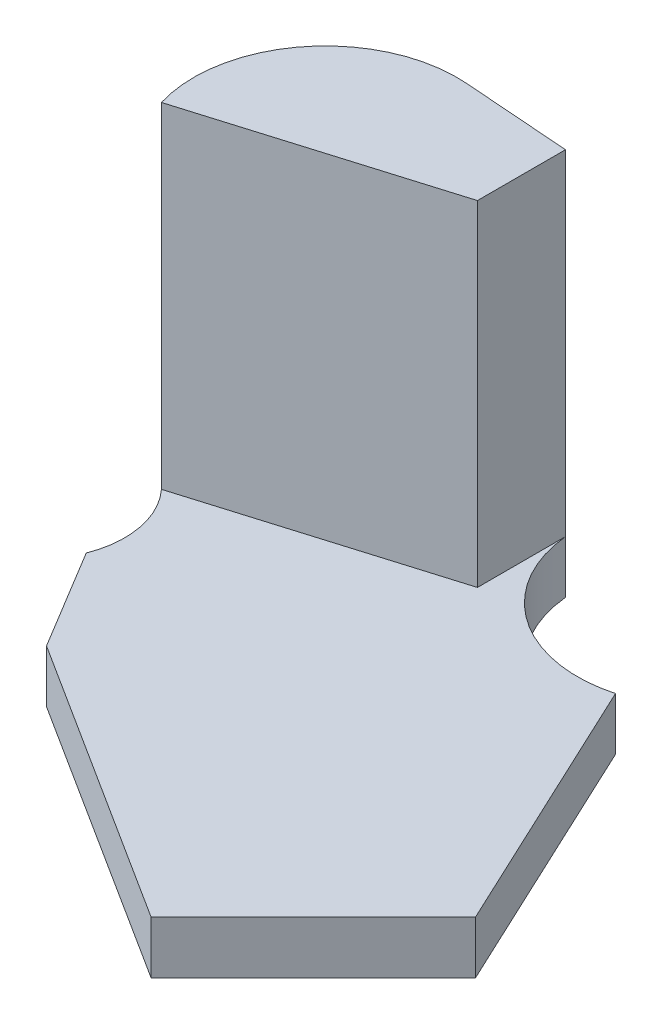
ISO-10303-21;
HEADER;
FILE_DESCRIPTION(('STEP AP214'),'2;1');
FILE_NAME('part.step','',(''),(''),'','','');
FILE_SCHEMA(('AUTOMOTIVE_DESIGN { 1 0 10303 214 1 1 1 1 }'));
ENDSEC;
DATA;
#1=APPLICATION_CONTEXT('core data for automotive mechanical design processes');
#2=APPLICATION_PROTOCOL_DEFINITION('international standard','automotive_design',2000,#1);
#3=PRODUCT_CONTEXT('',#1,'mechanical');
#4=PRODUCT('Part','Part','',(#3));
#5=PRODUCT_RELATED_PRODUCT_CATEGORY('part','',(#4));
#6=PRODUCT_DEFINITION_FORMATION('','',#4);
#7=PRODUCT_DEFINITION_CONTEXT('part definition',#1,'design');
#8=PRODUCT_DEFINITION('design','',#6,#7);
#9=PRODUCT_DEFINITION_SHAPE('','',#8);
#10=(LENGTH_UNIT() NAMED_UNIT(*) SI_UNIT(.MILLI.,.METRE.));
#11=(NAMED_UNIT(*) PLANE_ANGLE_UNIT() SI_UNIT($,.RADIAN.));
#12=(NAMED_UNIT(*) SI_UNIT($,.STERADIAN.) SOLID_ANGLE_UNIT());
#13=UNCERTAINTY_MEASURE_WITH_UNIT(LENGTH_MEASURE(1.E-05),#10,'distance_accuracy_value','');
#14=(GEOMETRIC_REPRESENTATION_CONTEXT(3) GLOBAL_UNCERTAINTY_ASSIGNED_CONTEXT((#13)) GLOBAL_UNIT_ASSIGNED_CONTEXT((#10,
#11,#12)) REPRESENTATION_CONTEXT('',''));
#15=CARTESIAN_POINT('',(0.,0.,0.));
#16=DIRECTION('',(0.,0.,1.));
#17=DIRECTION('',(1.,0.,0.));
#18=AXIS2_PLACEMENT_3D('',#15,#16,#17);
#19=CARTESIAN_POINT('',(-494.715705206403,-35.9967992820007,48.5897073050743));
#20=DIRECTION('',(0.,-1.,0.));
#21=DIRECTION('',(0.,0.,-1.));
#22=AXIS2_PLACEMENT_3D('',#19,#20,#21);
#23=PLANE('',#22);
#24=CARTESIAN_POINT('',(-494.715705206403,-35.9967992820007,48.5897073050743));
#25=DIRECTION('',(0.,-1.,0.));
#26=DIRECTION('',(0.,0.,-1.));
#27=AXIS2_PLACEMENT_3D('',#24,#25,#26);
#28=CIRCLE('',#27,19.05);
#29=CARTESIAN_POINT('',(-512.958981794907,-35.9967992820007,54.0747195489409));
#30=VERTEX_POINT('',#29);
#31=CARTESIAN_POINT('',(-493.297876549059,-35.9967992820007,29.5925427298433));
#32=VERTEX_POINT('',#31);
#33=EDGE_CURVE('E164',#30,#32,#28,.T.);
#34=ORIENTED_EDGE('',*,*,#33,.F.);
#35=DIRECTION('',(-0.957652314357131,0.,0.287927151909005));
#36=VECTOR('',#35,1.);
#37=CARTESIAN_POINT('',(-512.958981794907,-35.9967992820007,54.0747195489409));
#38=LINE('',#37,#36);
#39=CARTESIAN_POINT('',(-477.784341144421,-35.9967992820007,43.4991338691676));
#40=VERTEX_POINT('',#39);
#41=EDGE_CURVE('E172',#40,#30,#38,.T.);
#42=ORIENTED_EDGE('',*,*,#41,.F.);
#43=DIRECTION('',(0.,0.,1.));
#44=VECTOR('',#43,1.);
#45=CARTESIAN_POINT('',(-477.784341144421,-35.9967992820007,43.4991338691676));
#46=LINE('',#45,#44);
#47=CARTESIAN_POINT('',(-477.784341144421,-35.9967992820007,30.7503752572352));
#48=VERTEX_POINT('',#47);
#49=EDGE_CURVE('E169',#48,#40,#46,.T.);
#50=ORIENTED_EDGE('',*,*,#49,.F.);
#51=DIRECTION('',(0.997226486888769,0.,0.0744267011729258));
#52=VECTOR('',#51,1.);
#53=CARTESIAN_POINT('',(-477.784341144421,-35.9967992820007,30.7503752572352));
#54=LINE('',#53,#52);
#55=EDGE_CURVE('E166',#32,#48,#54,.T.);
#56=ORIENTED_EDGE('',*,*,#55,.F.);
#57=EDGE_LOOP('',(#34,#42,#50,#56));
#58=FACE_BOUND('',#57,.T.);
#59=ADVANCED_FACE('F33',(#58),#23,.F.);
#60=CARTESIAN_POINT('',(-512.958981794907,-128.061062811696,54.0747195489409));
#61=DIRECTION('',(-0.287927151909005,0.,-0.95765231435713));
#62=DIRECTION('',(-0.957652314357131,0.,0.287927151909005));
#63=AXIS2_PLACEMENT_3D('',#60,#61,#62);
#64=PLANE('',#63);
#65=DIRECTION('',(0.,1.,0.));
#66=VECTOR('',#65,1.);
#67=CARTESIAN_POINT('',(-512.958981794907,-128.061062811696,54.0747195489409));
#68=LINE('',#67,#66);
#69=CARTESIAN_POINT('',(-512.958981794907,-84.510800062,54.0747195489409));
#70=VERTEX_POINT('',#69);
#71=EDGE_CURVE('E55',#70,#30,#68,.T.);
#72=ORIENTED_EDGE('',*,*,#71,.F.);
#73=DIRECTION('',(0.957652314357131,0.,-0.287927151909005));
#74=VECTOR('',#73,1.);
#75=CARTESIAN_POINT('',(-512.958981794907,-84.510800062,54.0747195489409));
#76=LINE('',#75,#74);
#77=CARTESIAN_POINT('',(-477.784341144421,-84.510800062,43.4991338691676));
#78=VERTEX_POINT('',#77);
#79=EDGE_CURVE('E37',#70,#78,#76,.T.);
#80=ORIENTED_EDGE('',*,*,#79,.T.);
#81=DIRECTION('',(0.,1.,0.));
#82=VECTOR('',#81,1.);
#83=CARTESIAN_POINT('',(-477.784341144421,-128.061062811696,43.4991338691676));
#84=LINE('',#83,#82);
#85=EDGE_CURVE('E175',#78,#40,#84,.T.);
#86=ORIENTED_EDGE('',*,*,#85,.T.);
#87=ORIENTED_EDGE('',*,*,#41,.T.);
#88=EDGE_LOOP('',(#72,#80,#86,#87));
#89=FACE_BOUND('',#88,.T.);
#90=ADVANCED_FACE('F184',(#89),#64,.F.);
#91=CARTESIAN_POINT('',(-477.784341144421,-128.061062811696,43.4991338691676));
#92=DIRECTION('',(-1.,0.,0.));
#93=DIRECTION('',(0.,0.,1.));
#94=AXIS2_PLACEMENT_3D('',#91,#92,#93);
#95=PLANE('',#94);
#96=ORIENTED_EDGE('',*,*,#85,.F.);
#97=DIRECTION('',(0.,0.,-1.));
#98=VECTOR('',#97,1.);
#99=CARTESIAN_POINT('',(-477.784341144421,-84.510800062,43.4991338691676));
#100=LINE('',#99,#98);
#101=CARTESIAN_POINT('',(-477.784341144421,-84.510800062,30.7503752572352));
#102=VERTEX_POINT('',#101);
#103=EDGE_CURVE('E11',#78,#102,#100,.T.);
#104=ORIENTED_EDGE('',*,*,#103,.T.);
#105=DIRECTION('',(0.,1.,0.));
#106=VECTOR('',#105,1.);
#107=CARTESIAN_POINT('',(-477.784341144421,-128.061062811696,30.7503752572352));
#108=LINE('',#107,#106);
#109=EDGE_CURVE('E177',#102,#48,#108,.T.);
#110=ORIENTED_EDGE('',*,*,#109,.T.);
#111=ORIENTED_EDGE('',*,*,#49,.T.);
#112=EDGE_LOOP('',(#96,#104,#110,#111));
#113=FACE_BOUND('',#112,.T.);
#114=ADVANCED_FACE('F229',(#113),#95,.F.);
#115=CARTESIAN_POINT('',(-477.784341144421,-128.061062811696,30.7503752572352));
#116=DIRECTION('',(-0.0744267011729258,0.,0.997226486888769));
#117=DIRECTION('',(0.997226486888769,0.,0.0744267011729258));
#118=AXIS2_PLACEMENT_3D('',#115,#116,#117);
#119=PLANE('',#118);
#120=ORIENTED_EDGE('',*,*,#109,.F.);
#121=DIRECTION('',(0.,1.,0.));
#122=VECTOR('',#121,1.);
#123=CARTESIAN_POINT('',(-477.784341144421,-202.521541733011,30.7503752572352));
#124=LINE('',#123,#122);
#125=CARTESIAN_POINT('',(-477.784341144421,-92.130800062,30.7503752572352));
#126=VERTEX_POINT('',#125);
#127=EDGE_CURVE('E156',#126,#102,#124,.T.);
#128=ORIENTED_EDGE('',*,*,#127,.F.);
#129=DIRECTION('',(-0.997226486888769,0.,-0.074426701172926));
#130=VECTOR('',#129,1.);
#131=CARTESIAN_POINT('',(-493.297876549059,-92.130800062,29.5925427298433));
#132=LINE('',#131,#130);
#133=CARTESIAN_POINT('',(-493.297876549059,-92.130800062,29.5925427298433));
#134=VERTEX_POINT('',#133);
#135=EDGE_CURVE('E195',#126,#134,#132,.T.);
#136=ORIENTED_EDGE('',*,*,#135,.T.);
#137=DIRECTION('',(0.,1.,0.));
#138=VECTOR('',#137,1.);
#139=CARTESIAN_POINT('',(-493.297876549059,-128.061062811696,29.5925427298433));
#140=LINE('',#139,#138);
#141=EDGE_CURVE('E178',#134,#32,#140,.T.);
#142=ORIENTED_EDGE('',*,*,#141,.T.);
#143=ORIENTED_EDGE('',*,*,#55,.T.);
#144=EDGE_LOOP('',(#120,#128,#136,#142,#143));
#145=FACE_BOUND('',#144,.T.);
#146=ADVANCED_FACE('F236',(#145),#119,.F.);
#147=CARTESIAN_POINT('',(-494.715705206403,-128.061062811696,48.5897073050743));
#148=DIRECTION('',(0.,1.,0.));
#149=DIRECTION('',(0.,0.,1.));
#150=AXIS2_PLACEMENT_3D('',#147,#148,#149);
#151=CYLINDRICAL_SURFACE('',#150,19.05);
#152=ORIENTED_EDGE('',*,*,#141,.F.);
#153=CARTESIAN_POINT('',(-494.715705206403,-92.130800062,48.5897073050743));
#154=DIRECTION('',(0.,1.,0.));
#155=DIRECTION('',(-1.,0.,0.));
#156=AXIS2_PLACEMENT_3D('',#153,#154,#155);
#157=CIRCLE('',#156,19.05);
#158=CARTESIAN_POINT('',(-512.958981794907,-92.130800062,54.0747195489409));
#159=VERTEX_POINT('',#158);
#160=EDGE_CURVE('E188',#134,#159,#157,.T.);
#161=ORIENTED_EDGE('',*,*,#160,.T.);
#162=DIRECTION('',(0.,1.,0.));
#163=VECTOR('',#162,1.);
#164=CARTESIAN_POINT('',(-512.958981794907,-202.521541733011,54.0747195489409));
#165=LINE('',#164,#163);
#166=EDGE_CURVE('E158',#159,#70,#165,.T.);
#167=ORIENTED_EDGE('',*,*,#166,.T.);
#168=ORIENTED_EDGE('',*,*,#71,.T.);
#169=ORIENTED_EDGE('',*,*,#33,.T.);
#170=EDGE_LOOP('',(#152,#161,#167,#168,#169));
#171=FACE_BOUND('',#170,.T.);
#172=ADVANCED_FACE('F35',(#171),#151,.T.);
#173=CARTESIAN_POINT('',(-522.452719054345,-84.510800062,62.8250492098397));
#174=DIRECTION('',(0.,1.,0.));
#175=DIRECTION('',(-1.,0.,0.));
#176=AXIS2_PLACEMENT_3D('',#173,#174,#175);
#177=PLANE('',#176);
#178=ORIENTED_EDGE('',*,*,#103,.F.);
#179=ORIENTED_EDGE('',*,*,#79,.F.);
#180=CARTESIAN_POINT('',(-522.452719054345,-84.510800062,62.8250492098397));
#181=DIRECTION('',(0.,1.,0.));
#182=DIRECTION('',(-1.,0.,0.));
#183=AXIS2_PLACEMENT_3D('',#180,#181,#182);
#184=CIRCLE('',#183,12.91120894129);
#185=CARTESIAN_POINT('',(-510.419261272625,-84.510800062,67.5042809994834));
#186=VERTEX_POINT('',#185);
#187=EDGE_CURVE('E131',#186,#70,#184,.T.);
#188=ORIENTED_EDGE('',*,*,#187,.F.);
#189=DIRECTION('',(-0.516817235128694,0.,-0.856095757187204));
#190=VECTOR('',#189,1.);
#191=CARTESIAN_POINT('',(-501.653310228558,-84.510800062,82.0248754890756));
#192=LINE('',#191,#190);
#193=CARTESIAN_POINT('',(-501.653310228558,-84.510800062,82.0248754890756));
#194=VERTEX_POINT('',#193);
#195=EDGE_CURVE('E117',#194,#186,#192,.T.);
#196=ORIENTED_EDGE('',*,*,#195,.F.);
#197=DIRECTION('',(-0.843896983197998,0.,-0.536505248575741));
#198=VECTOR('',#197,1.);
#199=CARTESIAN_POINT('',(-460.055260418092,-84.510800062,108.470724328654));
#200=LINE('',#199,#198);
#201=CARTESIAN_POINT('',(-460.055260418092,-84.510800062,108.470724328654));
#202=VERTEX_POINT('',#201);
#203=EDGE_CURVE('E129',#202,#194,#200,.T.);
#204=ORIENTED_EDGE('',*,*,#203,.F.);
#205=DIRECTION('',(-0.706636743080918,0.,0.707576507049232));
#206=VECTOR('',#205,1.);
#207=CARTESIAN_POINT('',(-460.055260418092,-84.510800062,108.470724328654));
#208=LINE('',#207,#206);
#209=CARTESIAN_POINT('',(-436.59051231193,-84.510800062,84.9747701961823));
#210=VERTEX_POINT('',#209);
#211=EDGE_CURVE('E149',#210,#202,#208,.T.);
#212=ORIENTED_EDGE('',*,*,#211,.F.);
#213=DIRECTION('',(0.424571064740077,0.,0.905394616167711));
#214=VECTOR('',#213,1.);
#215=CARTESIAN_POINT('',(-436.59051231193,-84.510800062,84.9747701961823));
#216=LINE('',#215,#214);
#217=CARTESIAN_POINT('',(-454.490518062896,-84.510800062,46.8031419760217));
#218=VERTEX_POINT('',#217);
#219=EDGE_CURVE('E146',#218,#210,#216,.T.);
#220=ORIENTED_EDGE('',*,*,#219,.F.);
#221=CARTESIAN_POINT('',(-459.359636033362,-84.510800062,28.9416487520585));
#222=DIRECTION('',(0.,1.,0.));
#223=DIRECTION('',(-1.,0.,0.));
#224=AXIS2_PLACEMENT_3D('',#221,#222,#223);
#225=CIRCLE('',#224,18.5132722661339);
#226=EDGE_CURVE('E143',#102,#218,#225,.T.);
#227=ORIENTED_EDGE('',*,*,#226,.F.);
#228=EDGE_LOOP('',(#178,#179,#188,#196,#204,#212,#220,#227));
#229=FACE_BOUND('',#228,.T.);
#230=ADVANCED_FACE('F127',(#229),#177,.T.);
#231=CARTESIAN_POINT('',(-460.055260418092,-202.521541733011,108.470724328654));
#232=DIRECTION('',(-0.707576507049232,0.,-0.706636743080918));
#233=DIRECTION('',(-0.706636743080918,0.,0.707576507049232));
#234=AXIS2_PLACEMENT_3D('',#231,#232,#233);
#235=PLANE('',#234);
#236=DIRECTION('',(0.,1.,0.));
#237=VECTOR('',#236,1.);
#238=CARTESIAN_POINT('',(-460.055260418092,-202.521541733011,108.470724328654));
#239=LINE('',#238,#237);
#240=CARTESIAN_POINT('',(-460.055260418092,-92.130800062,108.470724328654));
#241=VERTEX_POINT('',#240);
#242=EDGE_CURVE('E135',#241,#202,#239,.T.);
#243=ORIENTED_EDGE('',*,*,#242,.F.);
#244=DIRECTION('',(0.706636743080918,0.,-0.707576507049232));
#245=VECTOR('',#244,1.);
#246=CARTESIAN_POINT('',(-460.055260418092,-92.130800062,108.470724328654));
#247=LINE('',#246,#245);
#248=CARTESIAN_POINT('',(-436.59051231193,-92.130800062,84.9747701961823));
#249=VERTEX_POINT('',#248);
#250=EDGE_CURVE('E123',#241,#249,#247,.T.);
#251=ORIENTED_EDGE('',*,*,#250,.T.);
#252=DIRECTION('',(0.,1.,0.));
#253=VECTOR('',#252,1.);
#254=CARTESIAN_POINT('',(-436.59051231193,-202.521541733011,84.9747701961824));
#255=LINE('',#254,#253);
#256=EDGE_CURVE('E152',#249,#210,#255,.T.);
#257=ORIENTED_EDGE('',*,*,#256,.T.);
#258=ORIENTED_EDGE('',*,*,#211,.T.);
#259=EDGE_LOOP('',(#243,#251,#257,#258));
#260=FACE_BOUND('',#259,.T.);
#261=ADVANCED_FACE('F214',(#260),#235,.F.);
#262=CARTESIAN_POINT('',(-436.59051231193,-202.521541733011,84.9747701961824));
#263=DIRECTION('',(-0.905394616167711,0.,0.424571064740077));
#264=DIRECTION('',(0.424571064740077,0.,0.905394616167711));
#265=AXIS2_PLACEMENT_3D('',#262,#263,#264);
#266=PLANE('',#265);
#267=ORIENTED_EDGE('',*,*,#256,.F.);
#268=DIRECTION('',(-0.424571064740077,0.,-0.905394616167711));
#269=VECTOR('',#268,1.);
#270=CARTESIAN_POINT('',(-436.59051231193,-92.130800062,84.9747701961823));
#271=LINE('',#270,#269);
#272=CARTESIAN_POINT('',(-454.490518062896,-92.130800062,46.8031419760217));
#273=VERTEX_POINT('',#272);
#274=EDGE_CURVE('E162',#249,#273,#271,.T.);
#275=ORIENTED_EDGE('',*,*,#274,.T.);
#276=DIRECTION('',(0.,1.,0.));
#277=VECTOR('',#276,1.);
#278=CARTESIAN_POINT('',(-454.490518062896,-202.521541733011,46.8031419760217));
#279=LINE('',#278,#277);
#280=EDGE_CURVE('E154',#273,#218,#279,.T.);
#281=ORIENTED_EDGE('',*,*,#280,.T.);
#282=ORIENTED_EDGE('',*,*,#219,.T.);
#283=EDGE_LOOP('',(#267,#275,#281,#282));
#284=FACE_BOUND('',#283,.T.);
#285=ADVANCED_FACE('F205',(#284),#266,.F.);
#286=CARTESIAN_POINT('',(-459.359636033363,-202.521541733011,28.9416487520585));
#287=DIRECTION('',(0.,1.,0.));
#288=DIRECTION('',(-1.,0.,0.));
#289=AXIS2_PLACEMENT_3D('',#286,#287,#288);
#290=CYLINDRICAL_SURFACE('',#289,18.5132722661339);
#291=ORIENTED_EDGE('',*,*,#280,.F.);
#292=CARTESIAN_POINT('',(-459.359636033362,-92.130800062,28.9416487520585));
#293=DIRECTION('',(0.,1.,0.));
#294=DIRECTION('',(-1.,0.,0.));
#295=AXIS2_PLACEMENT_3D('',#292,#293,#294);
#296=CIRCLE('',#295,18.5132722661339);
#297=EDGE_CURVE('E199',#273,#126,#296,.F.);
#298=ORIENTED_EDGE('',*,*,#297,.T.);
#299=ORIENTED_EDGE('',*,*,#127,.T.);
#300=ORIENTED_EDGE('',*,*,#226,.T.);
#301=EDGE_LOOP('',(#291,#298,#299,#300));
#302=FACE_BOUND('',#301,.T.);
#303=ADVANCED_FACE('F210',(#302),#290,.F.);
#304=CARTESIAN_POINT('',(-522.452719054345,-202.521541733011,62.8250492098397));
#305=DIRECTION('',(0.,1.,0.));
#306=DIRECTION('',(-1.,0.,0.));
#307=AXIS2_PLACEMENT_3D('',#304,#305,#306);
#308=CYLINDRICAL_SURFACE('',#307,12.91120894129);
#309=ORIENTED_EDGE('',*,*,#166,.F.);
#310=CARTESIAN_POINT('',(-522.452719054345,-92.130800062,62.8250492098397));
#311=DIRECTION('',(0.,1.,0.));
#312=DIRECTION('',(-1.,0.,0.));
#313=AXIS2_PLACEMENT_3D('',#310,#311,#312);
#314=CIRCLE('',#313,12.91120894129);
#315=CARTESIAN_POINT('',(-510.419261272625,-92.130800062,67.5042809994834));
#316=VERTEX_POINT('',#315);
#317=EDGE_CURVE('E192',#159,#316,#314,.F.);
#318=ORIENTED_EDGE('',*,*,#317,.T.);
#319=DIRECTION('',(0.,1.,0.));
#320=VECTOR('',#319,1.);
#321=CARTESIAN_POINT('',(-510.419261272625,-202.521541733011,67.5042809994834));
#322=LINE('',#321,#320);
#323=EDGE_CURVE('E124',#316,#186,#322,.T.);
#324=ORIENTED_EDGE('',*,*,#323,.T.);
#325=ORIENTED_EDGE('',*,*,#187,.T.);
#326=EDGE_LOOP('',(#309,#318,#324,#325));
#327=FACE_BOUND('',#326,.T.);
#328=ADVANCED_FACE('F191',(#327),#308,.F.);
#329=CARTESIAN_POINT('',(-501.653310228558,-202.521541733011,82.0248754890756));
#330=DIRECTION('',(0.856095757187204,0.,-0.516817235128694));
#331=DIRECTION('',(-0.516817235128694,0.,-0.856095757187204));
#332=AXIS2_PLACEMENT_3D('',#329,#330,#331);
#333=PLANE('',#332);
#334=ORIENTED_EDGE('',*,*,#323,.F.);
#335=DIRECTION('',(0.516817235128694,0.,0.856095757187204));
#336=VECTOR('',#335,1.);
#337=CARTESIAN_POINT('',(-501.653310228558,-92.130800062,82.0248754890756));
#338=LINE('',#337,#336);
#339=CARTESIAN_POINT('',(-501.653310228558,-92.130800062,82.0248754890756));
#340=VERTEX_POINT('',#339);
#341=EDGE_CURVE('E119',#316,#340,#338,.T.);
#342=ORIENTED_EDGE('',*,*,#341,.T.);
#343=DIRECTION('',(0.,1.,0.));
#344=VECTOR('',#343,1.);
#345=CARTESIAN_POINT('',(-501.653310228558,-202.521541733011,82.0248754890756));
#346=LINE('',#345,#344);
#347=EDGE_CURVE('E113',#340,#194,#346,.T.);
#348=ORIENTED_EDGE('',*,*,#347,.T.);
#349=ORIENTED_EDGE('',*,*,#195,.T.);
#350=EDGE_LOOP('',(#334,#342,#348,#349));
#351=FACE_BOUND('',#350,.T.);
#352=ADVANCED_FACE('F116',(#351),#333,.F.);
#353=CARTESIAN_POINT('',(-460.055260418092,-202.521541733011,108.470724328654));
#354=DIRECTION('',(0.536505248575741,0.,-0.843896983197998));
#355=DIRECTION('',(-0.843896983197998,0.,-0.536505248575741));
#356=AXIS2_PLACEMENT_3D('',#353,#354,#355);
#357=PLANE('',#356);
#358=ORIENTED_EDGE('',*,*,#347,.F.);
#359=DIRECTION('',(0.843896983197998,0.,0.536505248575741));
#360=VECTOR('',#359,1.);
#361=CARTESIAN_POINT('',(-460.055260418092,-92.130800062,108.470724328654));
#362=LINE('',#361,#360);
#363=EDGE_CURVE('E139',#340,#241,#362,.T.);
#364=ORIENTED_EDGE('',*,*,#363,.T.);
#365=ORIENTED_EDGE('',*,*,#242,.T.);
#366=ORIENTED_EDGE('',*,*,#203,.T.);
#367=EDGE_LOOP('',(#358,#364,#365,#366));
#368=FACE_BOUND('',#367,.T.);
#369=ADVANCED_FACE('F133',(#368),#357,.F.);
#370=CARTESIAN_POINT('',(-438.150016701856,-92.130800062,160.02));
#371=DIRECTION('',(0.,1.,0.));
#372=DIRECTION('',(3.01301518557797E-06,0.,-0.999999999995461));
#373=AXIS2_PLACEMENT_3D('',#370,#371,#372);
#374=PLANE('',#373);
#375=ORIENTED_EDGE('',*,*,#341,.F.);
#376=ORIENTED_EDGE('',*,*,#317,.F.);
#377=ORIENTED_EDGE('',*,*,#160,.F.);
#378=ORIENTED_EDGE('',*,*,#135,.F.);
#379=ORIENTED_EDGE('',*,*,#297,.F.);
#380=ORIENTED_EDGE('',*,*,#274,.F.);
#381=ORIENTED_EDGE('',*,*,#250,.F.);
#382=ORIENTED_EDGE('',*,*,#363,.F.);
#383=EDGE_LOOP('',(#375,#376,#377,#378,#379,#380,#381,#382));
#384=FACE_BOUND('',#383,.T.);
#385=ADVANCED_FACE('F207',(#384),#374,.F.);
#386=CLOSED_SHELL('',(#59,#90,#114,#146,#172,#230,#261,#285,#303,#328,#352,#369,#385));
#387=MANIFOLD_SOLID_BREP('B2',#386);
#388=ADVANCED_BREP_SHAPE_REPRESENTATION('',(#18,#387),#14);
#389=SHAPE_DEFINITION_REPRESENTATION(#9,#388);
ENDSEC;
END-ISO-10303-21;
